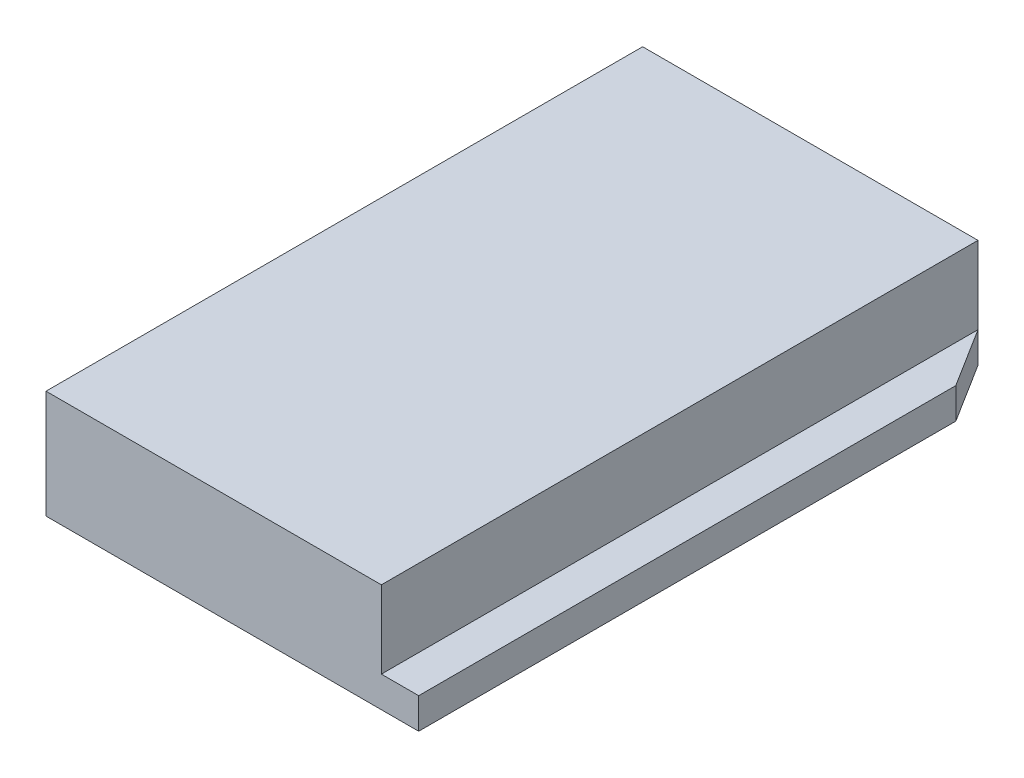
ISO-10303-21;
HEADER;
FILE_DESCRIPTION(('STEP AP214'),'2;1');
FILE_NAME('part.step','',(''),(''),'','','');
FILE_SCHEMA(('AUTOMOTIVE_DESIGN { 1 0 10303 214 1 1 1 1 }'));
ENDSEC;
DATA;
#1=APPLICATION_CONTEXT('core data for automotive mechanical design processes');
#2=APPLICATION_PROTOCOL_DEFINITION('international standard','automotive_design',2000,#1);
#3=PRODUCT_CONTEXT('',#1,'mechanical');
#4=PRODUCT('Part','Part','',(#3));
#5=PRODUCT_RELATED_PRODUCT_CATEGORY('part','',(#4));
#6=PRODUCT_DEFINITION_FORMATION('','',#4);
#7=PRODUCT_DEFINITION_CONTEXT('part definition',#1,'design');
#8=PRODUCT_DEFINITION('design','',#6,#7);
#9=PRODUCT_DEFINITION_SHAPE('','',#8);
#10=(LENGTH_UNIT() NAMED_UNIT(*) SI_UNIT(.MILLI.,.METRE.));
#11=(NAMED_UNIT(*) PLANE_ANGLE_UNIT() SI_UNIT($,.RADIAN.));
#12=(NAMED_UNIT(*) SI_UNIT($,.STERADIAN.) SOLID_ANGLE_UNIT());
#13=UNCERTAINTY_MEASURE_WITH_UNIT(LENGTH_MEASURE(1.E-05),#10,'distance_accuracy_value','');
#14=(GEOMETRIC_REPRESENTATION_CONTEXT(3) GLOBAL_UNCERTAINTY_ASSIGNED_CONTEXT((#13)) GLOBAL_UNIT_ASSIGNED_CONTEXT((#10,
#11,#12)) REPRESENTATION_CONTEXT('',''));
#15=CARTESIAN_POINT('',(0.,0.,0.));
#16=DIRECTION('',(0.,0.,1.));
#17=DIRECTION('',(1.,0.,0.));
#18=AXIS2_PLACEMENT_3D('',#15,#16,#17);
#19=CARTESIAN_POINT('',(0.,2.54,0.));
#20=DIRECTION('',(1.,0.,0.));
#21=DIRECTION('',(0.,0.,-1.));
#22=AXIS2_PLACEMENT_3D('',#19,#20,#21);
#23=PLANE('',#22);
#24=DIRECTION('',(0.,0.,1.));
#25=VECTOR('',#24,1.);
#26=CARTESIAN_POINT('',(0.,0.,0.));
#27=LINE('',#26,#25);
#28=CARTESIAN_POINT('',(0.,0.,-14.0081));
#29=VERTEX_POINT('',#28);
#30=CARTESIAN_POINT('',(0.,0.,0.));
#31=VERTEX_POINT('',#30);
#32=EDGE_CURVE('E222',#29,#31,#27,.T.);
#33=ORIENTED_EDGE('',*,*,#32,.T.);
#34=DIRECTION('',(0.,-1.,0.));
#35=VECTOR('',#34,1.);
#36=CARTESIAN_POINT('',(0.,2.54,0.));
#37=LINE('',#36,#35);
#38=CARTESIAN_POINT('',(0.,2.54,0.));
#39=VERTEX_POINT('',#38);
#40=EDGE_CURVE('E11',#39,#31,#37,.T.);
#41=ORIENTED_EDGE('',*,*,#40,.F.);
#42=DIRECTION('',(0.,0.,1.));
#43=VECTOR('',#42,1.);
#44=CARTESIAN_POINT('',(0.,2.54,0.));
#45=LINE('',#44,#43);
#46=CARTESIAN_POINT('',(0.,2.54,-14.0081));
#47=VERTEX_POINT('',#46);
#48=EDGE_CURVE('E219',#47,#39,#45,.T.);
#49=ORIENTED_EDGE('',*,*,#48,.F.);
#50=DIRECTION('',(0.,-1.,0.));
#51=VECTOR('',#50,1.);
#52=CARTESIAN_POINT('',(0.,2.54,-14.0081));
#53=LINE('',#52,#51);
#54=EDGE_CURVE('E208',#47,#29,#53,.T.);
#55=ORIENTED_EDGE('',*,*,#54,.T.);
#56=EDGE_LOOP('',(#33,#41,#49,#55));
#57=FACE_BOUND('',#56,.T.);
#58=ADVANCED_FACE('F32',(#57),#23,.F.);
#59=CARTESIAN_POINT('',(0.,2.54,0.));
#60=DIRECTION('',(0.,0.,-1.));
#61=DIRECTION('',(-1.,0.,0.));
#62=AXIS2_PLACEMENT_3D('',#59,#60,#61);
#63=PLANE('',#62);
#64=DIRECTION('',(1.,0.,0.));
#65=VECTOR('',#64,1.);
#66=CARTESIAN_POINT('',(0.,0.,0.));
#67=LINE('',#66,#65);
#68=CARTESIAN_POINT('',(8.7503,0.,0.));
#69=VERTEX_POINT('',#68);
#70=EDGE_CURVE('E220',#31,#69,#67,.T.);
#71=ORIENTED_EDGE('',*,*,#70,.T.);
#72=DIRECTION('',(0.,-1.,0.));
#73=VECTOR('',#72,1.);
#74=CARTESIAN_POINT('',(8.7503,0.7239,0.));
#75=LINE('',#74,#73);
#76=CARTESIAN_POINT('',(8.7503,0.7239,0.));
#77=VERTEX_POINT('',#76);
#78=EDGE_CURVE('E171',#77,#69,#75,.T.);
#79=ORIENTED_EDGE('',*,*,#78,.F.);
#80=DIRECTION('',(-1.,0.,0.));
#81=VECTOR('',#80,1.);
#82=CARTESIAN_POINT('',(7.874,0.7239,0.));
#83=LINE('',#82,#81);
#84=CARTESIAN_POINT('',(7.874,0.7239,0.));
#85=VERTEX_POINT('',#84);
#86=EDGE_CURVE('E176',#77,#85,#83,.T.);
#87=ORIENTED_EDGE('',*,*,#86,.T.);
#88=DIRECTION('',(0.,-1.,0.));
#89=VECTOR('',#88,1.);
#90=CARTESIAN_POINT('',(7.874,2.54,0.));
#91=LINE('',#90,#89);
#92=CARTESIAN_POINT('',(7.874,2.54,0.));
#93=VERTEX_POINT('',#92);
#94=EDGE_CURVE('E40',#93,#85,#91,.T.);
#95=ORIENTED_EDGE('',*,*,#94,.F.);
#96=DIRECTION('',(1.,0.,0.));
#97=VECTOR('',#96,1.);
#98=CARTESIAN_POINT('',(0.,2.54,0.));
#99=LINE('',#98,#97);
#100=EDGE_CURVE('E229',#39,#93,#99,.T.);
#101=ORIENTED_EDGE('',*,*,#100,.F.);
#102=ORIENTED_EDGE('',*,*,#40,.T.);
#103=EDGE_LOOP('',(#71,#79,#87,#95,#101,#102));
#104=FACE_BOUND('',#103,.T.);
#105=ADVANCED_FACE('F336',(#104),#63,.F.);
#106=CARTESIAN_POINT('',(7.874,2.54,0.));
#107=DIRECTION('',(-1.,0.,0.));
#108=DIRECTION('',(0.,0.,1.));
#109=AXIS2_PLACEMENT_3D('',#106,#107,#108);
#110=PLANE('',#109);
#111=ORIENTED_EDGE('',*,*,#94,.T.);
#112=DIRECTION('',(0.,0.,-1.));
#113=VECTOR('',#112,1.);
#114=CARTESIAN_POINT('',(7.874,0.7239,-14.0081));
#115=LINE('',#114,#113);
#116=CARTESIAN_POINT('',(7.874,0.7239,-14.0081));
#117=VERTEX_POINT('',#116);
#118=EDGE_CURVE('E172',#85,#117,#115,.T.);
#119=ORIENTED_EDGE('',*,*,#118,.T.);
#120=DIRECTION('',(0.,-1.,0.));
#121=VECTOR('',#120,1.);
#122=CARTESIAN_POINT('',(7.874,2.54,-14.0081));
#123=LINE('',#122,#121);
#124=CARTESIAN_POINT('',(7.874,2.54,-14.0081));
#125=VERTEX_POINT('',#124);
#126=EDGE_CURVE('E201',#125,#117,#123,.T.);
#127=ORIENTED_EDGE('',*,*,#126,.F.);
#128=DIRECTION('',(0.,0.,-1.));
#129=VECTOR('',#128,1.);
#130=CARTESIAN_POINT('',(7.874,2.54,0.));
#131=LINE('',#130,#129);
#132=EDGE_CURVE('E227',#93,#125,#131,.T.);
#133=ORIENTED_EDGE('',*,*,#132,.F.);
#134=EDGE_LOOP('',(#111,#119,#127,#133));
#135=FACE_BOUND('',#134,.T.);
#136=ADVANCED_FACE('F199',(#135),#110,.F.);
#137=CARTESIAN_POINT('',(0.,2.54,-14.0081));
#138=DIRECTION('',(0.,0.,1.));
#139=DIRECTION('',(1.,0.,0.));
#140=AXIS2_PLACEMENT_3D('',#137,#138,#139);
#141=PLANE('',#140);
#142=DIRECTION('',(-1.,0.,0.));
#143=VECTOR('',#142,1.);
#144=CARTESIAN_POINT('',(1.997075,0.8636,-14.0081));
#145=LINE('',#144,#143);
#146=CARTESIAN_POINT('',(1.997075,0.8636,-14.0081));
#147=VERTEX_POINT('',#146);
#148=CARTESIAN_POINT('',(0.89535,0.8636,-14.0081));
#149=VERTEX_POINT('',#148);
#150=EDGE_CURVE('E312',#147,#149,#145,.T.);
#151=ORIENTED_EDGE('',*,*,#150,.F.);
#152=DIRECTION('',(0.,-1.,0.));
#153=VECTOR('',#152,1.);
#154=CARTESIAN_POINT('',(1.997075,0.8636,-14.0081));
#155=LINE('',#154,#153);
#156=CARTESIAN_POINT('',(1.997075,1.8669,-14.0081));
#157=VERTEX_POINT('',#156);
#158=EDGE_CURVE('E56',#157,#147,#155,.T.);
#159=ORIENTED_EDGE('',*,*,#158,.F.);
#160=DIRECTION('',(1.,0.,0.));
#161=VECTOR('',#160,1.);
#162=CARTESIAN_POINT('',(1.997075,1.8669,-14.0081));
#163=LINE('',#162,#161);
#164=CARTESIAN_POINT('',(0.89535,1.8669,-14.0081));
#165=VERTEX_POINT('',#164);
#166=EDGE_CURVE('E305',#165,#157,#163,.T.);
#167=ORIENTED_EDGE('',*,*,#166,.F.);
#168=DIRECTION('',(0.,1.,0.));
#169=VECTOR('',#168,1.);
#170=CARTESIAN_POINT('',(0.89535,0.8636,-14.0081));
#171=LINE('',#170,#169);
#172=EDGE_CURVE('E309',#149,#165,#171,.T.);
#173=ORIENTED_EDGE('',*,*,#172,.F.);
#174=EDGE_LOOP('',(#151,#159,#167,#173));
#175=FACE_BOUND('',#174,.T.);
#176=DIRECTION('',(-1.,0.,0.));
#177=VECTOR('',#176,1.);
#178=CARTESIAN_POINT('',(4.5227875,0.8636,-14.0081));
#179=LINE('',#178,#177);
#180=CARTESIAN_POINT('',(4.5227875,0.8636,-14.0081));
#181=VERTEX_POINT('',#180);
#182=CARTESIAN_POINT('',(3.4210625,0.8636,-14.0081));
#183=VERTEX_POINT('',#182);
#184=EDGE_CURVE('E281',#181,#183,#179,.T.);
#185=ORIENTED_EDGE('',*,*,#184,.F.);
#186=DIRECTION('',(0.,-1.,0.));
#187=VECTOR('',#186,1.);
#188=CARTESIAN_POINT('',(4.5227875,1.8669,-14.0081));
#189=LINE('',#188,#187);
#190=CARTESIAN_POINT('',(4.5227875,1.8669,-14.0081));
#191=VERTEX_POINT('',#190);
#192=EDGE_CURVE('E284',#191,#181,#189,.T.);
#193=ORIENTED_EDGE('',*,*,#192,.F.);
#194=DIRECTION('',(1.,0.,0.));
#195=VECTOR('',#194,1.);
#196=CARTESIAN_POINT('',(4.5227875,1.8669,-14.0081));
#197=LINE('',#196,#195);
#198=CARTESIAN_POINT('',(3.4210625,1.8669,-14.0081));
#199=VERTEX_POINT('',#198);
#200=EDGE_CURVE('E274',#199,#191,#197,.T.);
#201=ORIENTED_EDGE('',*,*,#200,.F.);
#202=DIRECTION('',(0.,1.,0.));
#203=VECTOR('',#202,1.);
#204=CARTESIAN_POINT('',(3.4210625,1.8669,-14.0081));
#205=LINE('',#204,#203);
#206=EDGE_CURVE('E278',#183,#199,#205,.T.);
#207=ORIENTED_EDGE('',*,*,#206,.F.);
#208=EDGE_LOOP('',(#185,#193,#201,#207));
#209=FACE_BOUND('',#208,.T.);
#210=DIRECTION('',(-1.,0.,0.));
#211=VECTOR('',#210,1.);
#212=CARTESIAN_POINT('',(7.0485,0.8636,-14.0081));
#213=LINE('',#212,#211);
#214=CARTESIAN_POINT('',(7.0485,0.8636,-14.0081));
#215=VERTEX_POINT('',#214);
#216=CARTESIAN_POINT('',(5.946775,0.8636,-14.0081));
#217=VERTEX_POINT('',#216);
#218=EDGE_CURVE('E249',#215,#217,#213,.T.);
#219=ORIENTED_EDGE('',*,*,#218,.F.);
#220=DIRECTION('',(0.,-1.,0.));
#221=VECTOR('',#220,1.);
#222=CARTESIAN_POINT('',(7.0485,1.8669,-14.0081));
#223=LINE('',#222,#221);
#224=CARTESIAN_POINT('',(7.0485,1.8669,-14.0081));
#225=VERTEX_POINT('',#224);
#226=EDGE_CURVE('E252',#225,#215,#223,.T.);
#227=ORIENTED_EDGE('',*,*,#226,.F.);
#228=DIRECTION('',(1.,0.,0.));
#229=VECTOR('',#228,1.);
#230=CARTESIAN_POINT('',(7.0485,1.8669,-14.0081));
#231=LINE('',#230,#229);
#232=CARTESIAN_POINT('',(5.946775,1.8669,-14.0081));
#233=VERTEX_POINT('',#232);
#234=EDGE_CURVE('E242',#233,#225,#231,.T.);
#235=ORIENTED_EDGE('',*,*,#234,.F.);
#236=DIRECTION('',(0.,1.,0.));
#237=VECTOR('',#236,1.);
#238=CARTESIAN_POINT('',(5.946775,1.8669,-14.0081));
#239=LINE('',#238,#237);
#240=EDGE_CURVE('E246',#217,#233,#239,.T.);
#241=ORIENTED_EDGE('',*,*,#240,.F.);
#242=EDGE_LOOP('',(#219,#227,#235,#241));
#243=FACE_BOUND('',#242,.T.);
#244=DIRECTION('',(-1.,0.,0.));
#245=VECTOR('',#244,1.);
#246=CARTESIAN_POINT('',(0.,0.,-14.0081));
#247=LINE('',#246,#245);
#248=CARTESIAN_POINT('',(7.874,0.,-14.0081));
#249=VERTEX_POINT('',#248);
#250=EDGE_CURVE('E217',#249,#29,#247,.T.);
#251=ORIENTED_EDGE('',*,*,#250,.T.);
#252=ORIENTED_EDGE('',*,*,#54,.F.);
#253=DIRECTION('',(-1.,0.,0.));
#254=VECTOR('',#253,1.);
#255=CARTESIAN_POINT('',(0.,2.54,-14.0081));
#256=LINE('',#255,#254);
#257=EDGE_CURVE('E207',#125,#47,#256,.T.);
#258=ORIENTED_EDGE('',*,*,#257,.F.);
#259=ORIENTED_EDGE('',*,*,#126,.T.);
#260=DIRECTION('',(0.,-1.,0.));
#261=VECTOR('',#260,1.);
#262=CARTESIAN_POINT('',(7.874,0.7239,-14.0081));
#263=LINE('',#262,#261);
#264=EDGE_CURVE('E180',#117,#249,#263,.T.);
#265=ORIENTED_EDGE('',*,*,#264,.T.);
#266=EDGE_LOOP('',(#251,#252,#258,#259,#265));
#267=FACE_BOUND('',#266,.T.);
#268=ADVANCED_FACE('F204',(#175,#209,#243,#267),#141,.F.);
#269=CARTESIAN_POINT('',(0.,2.54,0.));
#270=DIRECTION('',(0.,-1.,0.));
#271=DIRECTION('',(0.,0.,-1.));
#272=AXIS2_PLACEMENT_3D('',#269,#270,#271);
#273=PLANE('',#272);
#274=ORIENTED_EDGE('',*,*,#48,.T.);
#275=ORIENTED_EDGE('',*,*,#100,.T.);
#276=ORIENTED_EDGE('',*,*,#132,.T.);
#277=ORIENTED_EDGE('',*,*,#257,.T.);
#278=EDGE_LOOP('',(#274,#275,#276,#277));
#279=FACE_BOUND('',#278,.T.);
#280=ADVANCED_FACE('F335',(#279),#273,.F.);
#281=CARTESIAN_POINT('',(0.,0.,0.));
#282=DIRECTION('',(0.,-1.,0.));
#283=DIRECTION('',(0.,0.,-1.));
#284=AXIS2_PLACEMENT_3D('',#281,#282,#283);
#285=PLANE('',#284);
#286=ORIENTED_EDGE('',*,*,#32,.F.);
#287=ORIENTED_EDGE('',*,*,#250,.F.);
#288=DIRECTION('',(0.531382718815397,0.,0.847131870575271));
#289=VECTOR('',#288,1.);
#290=CARTESIAN_POINT('',(7.874,0.,-14.0081));
#291=LINE('',#290,#289);
#292=CARTESIAN_POINT('',(8.7503,0.,-12.6111));
#293=VERTEX_POINT('',#292);
#294=EDGE_CURVE('E183',#249,#293,#291,.T.);
#295=ORIENTED_EDGE('',*,*,#294,.T.);
#296=DIRECTION('',(0.,0.,1.));
#297=VECTOR('',#296,1.);
#298=CARTESIAN_POINT('',(8.7503,0.,-12.6111));
#299=LINE('',#298,#297);
#300=EDGE_CURVE('E168',#293,#69,#299,.T.);
#301=ORIENTED_EDGE('',*,*,#300,.T.);
#302=ORIENTED_EDGE('',*,*,#70,.F.);
#303=EDGE_LOOP('',(#286,#287,#295,#301,#302));
#304=FACE_BOUND('',#303,.T.);
#305=ADVANCED_FACE('F330',(#304),#285,.T.);
#306=CARTESIAN_POINT('',(7.0485,1.8669,-5.3721));
#307=DIRECTION('',(1.,0.,0.));
#308=DIRECTION('',(0.,0.,-1.));
#309=AXIS2_PLACEMENT_3D('',#306,#307,#308);
#310=PLANE('',#309);
#311=ORIENTED_EDGE('',*,*,#226,.T.);
#312=DIRECTION('',(0.,0.,-1.));
#313=VECTOR('',#312,1.);
#314=CARTESIAN_POINT('',(7.0485,0.8636,-5.3721));
#315=LINE('',#314,#313);
#316=CARTESIAN_POINT('',(7.0485,0.8636,-5.3721));
#317=VERTEX_POINT('',#316);
#318=EDGE_CURVE('E233',#317,#215,#315,.T.);
#319=ORIENTED_EDGE('',*,*,#318,.F.);
#320=DIRECTION('',(0.,-1.,0.));
#321=VECTOR('',#320,1.);
#322=CARTESIAN_POINT('',(7.0485,1.8669,-5.3721));
#323=LINE('',#322,#321);
#324=CARTESIAN_POINT('',(7.0485,1.8669,-5.3721));
#325=VERTEX_POINT('',#324);
#326=EDGE_CURVE('E245',#325,#317,#323,.T.);
#327=ORIENTED_EDGE('',*,*,#326,.F.);
#328=DIRECTION('',(0.,0.,-1.));
#329=VECTOR('',#328,1.);
#330=CARTESIAN_POINT('',(7.0485,1.8669,-5.3721));
#331=LINE('',#330,#329);
#332=EDGE_CURVE('E225',#325,#225,#331,.T.);
#333=ORIENTED_EDGE('',*,*,#332,.T.);
#334=EDGE_LOOP('',(#311,#319,#327,#333));
#335=FACE_BOUND('',#334,.T.);
#336=ADVANCED_FACE('F349',(#335),#310,.F.);
#337=CARTESIAN_POINT('',(7.0485,1.8669,-5.3721));
#338=DIRECTION('',(0.,1.,0.));
#339=DIRECTION('',(-1.,0.,0.));
#340=AXIS2_PLACEMENT_3D('',#337,#338,#339);
#341=PLANE('',#340);
#342=ORIENTED_EDGE('',*,*,#234,.T.);
#343=ORIENTED_EDGE('',*,*,#332,.F.);
#344=DIRECTION('',(1.,0.,0.));
#345=VECTOR('',#344,1.);
#346=CARTESIAN_POINT('',(7.0485,1.8669,-5.3721));
#347=LINE('',#346,#345);
#348=CARTESIAN_POINT('',(5.946775,1.8669,-5.3721));
#349=VERTEX_POINT('',#348);
#350=EDGE_CURVE('E237',#349,#325,#347,.T.);
#351=ORIENTED_EDGE('',*,*,#350,.F.);
#352=DIRECTION('',(0.,0.,-1.));
#353=VECTOR('',#352,1.);
#354=CARTESIAN_POINT('',(5.946775,1.8669,-5.3721));
#355=LINE('',#354,#353);
#356=EDGE_CURVE('E239',#349,#233,#355,.T.);
#357=ORIENTED_EDGE('',*,*,#356,.T.);
#358=EDGE_LOOP('',(#342,#343,#351,#357));
#359=FACE_BOUND('',#358,.T.);
#360=ADVANCED_FACE('F354',(#359),#341,.F.);
#361=CARTESIAN_POINT('',(5.946775,1.8669,-5.3721));
#362=DIRECTION('',(-1.,0.,0.));
#363=DIRECTION('',(0.,-1.,0.));
#364=AXIS2_PLACEMENT_3D('',#361,#362,#363);
#365=PLANE('',#364);
#366=ORIENTED_EDGE('',*,*,#240,.T.);
#367=ORIENTED_EDGE('',*,*,#356,.F.);
#368=DIRECTION('',(0.,1.,0.));
#369=VECTOR('',#368,1.);
#370=CARTESIAN_POINT('',(5.946775,1.8669,-5.3721));
#371=LINE('',#370,#369);
#372=CARTESIAN_POINT('',(5.946775,0.8636,-5.3721));
#373=VERTEX_POINT('',#372);
#374=EDGE_CURVE('E257',#373,#349,#371,.T.);
#375=ORIENTED_EDGE('',*,*,#374,.F.);
#376=DIRECTION('',(0.,0.,-1.));
#377=VECTOR('',#376,1.);
#378=CARTESIAN_POINT('',(5.946775,0.8636,-5.3721));
#379=LINE('',#378,#377);
#380=EDGE_CURVE('E236',#373,#217,#379,.T.);
#381=ORIENTED_EDGE('',*,*,#380,.T.);
#382=EDGE_LOOP('',(#366,#367,#375,#381));
#383=FACE_BOUND('',#382,.T.);
#384=ADVANCED_FACE('F360',(#383),#365,.F.);
#385=CARTESIAN_POINT('',(7.0485,0.8636,-5.3721));
#386=DIRECTION('',(0.,-1.,0.));
#387=DIRECTION('',(0.,0.,-1.));
#388=AXIS2_PLACEMENT_3D('',#385,#386,#387);
#389=PLANE('',#388);
#390=ORIENTED_EDGE('',*,*,#218,.T.);
#391=ORIENTED_EDGE('',*,*,#380,.F.);
#392=DIRECTION('',(-1.,0.,0.));
#393=VECTOR('',#392,1.);
#394=CARTESIAN_POINT('',(7.0485,0.8636,-5.3721));
#395=LINE('',#394,#393);
#396=EDGE_CURVE('E260',#317,#373,#395,.T.);
#397=ORIENTED_EDGE('',*,*,#396,.F.);
#398=ORIENTED_EDGE('',*,*,#318,.T.);
#399=EDGE_LOOP('',(#390,#391,#397,#398));
#400=FACE_BOUND('',#399,.T.);
#401=ADVANCED_FACE('F356',(#400),#389,.F.);
#402=CARTESIAN_POINT('',(0.,0.,-5.3721));
#403=DIRECTION('',(0.,0.,-1.));
#404=DIRECTION('',(-1.,0.,0.));
#405=AXIS2_PLACEMENT_3D('',#402,#403,#404);
#406=PLANE('',#405);
#407=ORIENTED_EDGE('',*,*,#326,.T.);
#408=ORIENTED_EDGE('',*,*,#396,.T.);
#409=ORIENTED_EDGE('',*,*,#374,.T.);
#410=ORIENTED_EDGE('',*,*,#350,.T.);
#411=EDGE_LOOP('',(#407,#408,#409,#410));
#412=FACE_BOUND('',#411,.T.);
#413=ADVANCED_FACE('F359',(#412),#406,.T.);
#414=CARTESIAN_POINT('',(4.5227875,1.8669,-5.3721));
#415=DIRECTION('',(1.,0.,0.));
#416=DIRECTION('',(0.,1.,0.));
#417=AXIS2_PLACEMENT_3D('',#414,#415,#416);
#418=PLANE('',#417);
#419=ORIENTED_EDGE('',*,*,#192,.T.);
#420=DIRECTION('',(0.,0.,-1.));
#421=VECTOR('',#420,1.);
#422=CARTESIAN_POINT('',(4.5227875,0.8636,-5.3721));
#423=LINE('',#422,#421);
#424=CARTESIAN_POINT('',(4.5227875,0.8636,-5.3721));
#425=VERTEX_POINT('',#424);
#426=EDGE_CURVE('E265',#425,#181,#423,.T.);
#427=ORIENTED_EDGE('',*,*,#426,.F.);
#428=DIRECTION('',(0.,-1.,0.));
#429=VECTOR('',#428,1.);
#430=CARTESIAN_POINT('',(4.5227875,1.8669,-5.3721));
#431=LINE('',#430,#429);
#432=CARTESIAN_POINT('',(4.5227875,1.8669,-5.3721));
#433=VERTEX_POINT('',#432);
#434=EDGE_CURVE('E277',#433,#425,#431,.T.);
#435=ORIENTED_EDGE('',*,*,#434,.F.);
#436=DIRECTION('',(0.,0.,-1.));
#437=VECTOR('',#436,1.);
#438=CARTESIAN_POINT('',(4.5227875,1.8669,-5.3721));
#439=LINE('',#438,#437);
#440=EDGE_CURVE('E254',#433,#191,#439,.T.);
#441=ORIENTED_EDGE('',*,*,#440,.T.);
#442=EDGE_LOOP('',(#419,#427,#435,#441));
#443=FACE_BOUND('',#442,.T.);
#444=ADVANCED_FACE('F370',(#443),#418,.F.);
#445=CARTESIAN_POINT('',(4.5227875,1.8669,-5.3721));
#446=DIRECTION('',(0.,1.,0.));
#447=DIRECTION('',(0.,0.,1.));
#448=AXIS2_PLACEMENT_3D('',#445,#446,#447);
#449=PLANE('',#448);
#450=ORIENTED_EDGE('',*,*,#200,.T.);
#451=ORIENTED_EDGE('',*,*,#440,.F.);
#452=DIRECTION('',(1.,0.,0.));
#453=VECTOR('',#452,1.);
#454=CARTESIAN_POINT('',(4.5227875,1.8669,-5.3721));
#455=LINE('',#454,#453);
#456=CARTESIAN_POINT('',(3.4210625,1.8669,-5.3721));
#457=VERTEX_POINT('',#456);
#458=EDGE_CURVE('E269',#457,#433,#455,.T.);
#459=ORIENTED_EDGE('',*,*,#458,.F.);
#460=DIRECTION('',(0.,0.,-1.));
#461=VECTOR('',#460,1.);
#462=CARTESIAN_POINT('',(3.4210625,1.8669,-5.3721));
#463=LINE('',#462,#461);
#464=EDGE_CURVE('E271',#457,#199,#463,.T.);
#465=ORIENTED_EDGE('',*,*,#464,.T.);
#466=EDGE_LOOP('',(#450,#451,#459,#465));
#467=FACE_BOUND('',#466,.T.);
#468=ADVANCED_FACE('F374',(#467),#449,.F.);
#469=CARTESIAN_POINT('',(3.4210625,1.8669,-5.3721));
#470=DIRECTION('',(-1.,0.,0.));
#471=DIRECTION('',(0.,0.,1.));
#472=AXIS2_PLACEMENT_3D('',#469,#470,#471);
#473=PLANE('',#472);
#474=ORIENTED_EDGE('',*,*,#206,.T.);
#475=ORIENTED_EDGE('',*,*,#464,.F.);
#476=DIRECTION('',(0.,1.,0.));
#477=VECTOR('',#476,1.);
#478=CARTESIAN_POINT('',(3.4210625,1.8669,-5.3721));
#479=LINE('',#478,#477);
#480=CARTESIAN_POINT('',(3.4210625,0.8636,-5.3721));
#481=VERTEX_POINT('',#480);
#482=EDGE_CURVE('E289',#481,#457,#479,.T.);
#483=ORIENTED_EDGE('',*,*,#482,.F.);
#484=DIRECTION('',(0.,0.,-1.));
#485=VECTOR('',#484,1.);
#486=CARTESIAN_POINT('',(3.4210625,0.8636,-5.3721));
#487=LINE('',#486,#485);
#488=EDGE_CURVE('E268',#481,#183,#487,.T.);
#489=ORIENTED_EDGE('',*,*,#488,.T.);
#490=EDGE_LOOP('',(#474,#475,#483,#489));
#491=FACE_BOUND('',#490,.T.);
#492=ADVANCED_FACE('F380',(#491),#473,.F.);
#493=CARTESIAN_POINT('',(4.5227875,0.8636,-5.3721));
#494=DIRECTION('',(0.,-1.,0.));
#495=DIRECTION('',(0.,0.,-1.));
#496=AXIS2_PLACEMENT_3D('',#493,#494,#495);
#497=PLANE('',#496);
#498=ORIENTED_EDGE('',*,*,#184,.T.);
#499=ORIENTED_EDGE('',*,*,#488,.F.);
#500=DIRECTION('',(-1.,0.,0.));
#501=VECTOR('',#500,1.);
#502=CARTESIAN_POINT('',(4.5227875,0.8636,-5.3721));
#503=LINE('',#502,#501);
#504=EDGE_CURVE('E292',#425,#481,#503,.T.);
#505=ORIENTED_EDGE('',*,*,#504,.F.);
#506=ORIENTED_EDGE('',*,*,#426,.T.);
#507=EDGE_LOOP('',(#498,#499,#505,#506));
#508=FACE_BOUND('',#507,.T.);
#509=ADVANCED_FACE('F376',(#508),#497,.F.);
#510=CARTESIAN_POINT('',(0.,0.,-5.3721));
#511=DIRECTION('',(0.,0.,-1.));
#512=DIRECTION('',(-1.,0.,0.));
#513=AXIS2_PLACEMENT_3D('',#510,#511,#512);
#514=PLANE('',#513);
#515=ORIENTED_EDGE('',*,*,#434,.T.);
#516=ORIENTED_EDGE('',*,*,#504,.T.);
#517=ORIENTED_EDGE('',*,*,#482,.T.);
#518=ORIENTED_EDGE('',*,*,#458,.T.);
#519=EDGE_LOOP('',(#515,#516,#517,#518));
#520=FACE_BOUND('',#519,.T.);
#521=ADVANCED_FACE('F379',(#520),#514,.T.);
#522=CARTESIAN_POINT('',(1.997075,0.8636,-5.3721));
#523=DIRECTION('',(1.,0.,0.));
#524=DIRECTION('',(0.,1.,0.));
#525=AXIS2_PLACEMENT_3D('',#522,#523,#524);
#526=PLANE('',#525);
#527=ORIENTED_EDGE('',*,*,#158,.T.);
#528=DIRECTION('',(0.,0.,-1.));
#529=VECTOR('',#528,1.);
#530=CARTESIAN_POINT('',(1.997075,0.8636,-5.3721));
#531=LINE('',#530,#529);
#532=CARTESIAN_POINT('',(1.997075,0.8636,-5.3721));
#533=VERTEX_POINT('',#532);
#534=EDGE_CURVE('E297',#533,#147,#531,.T.);
#535=ORIENTED_EDGE('',*,*,#534,.F.);
#536=DIRECTION('',(0.,-1.,0.));
#537=VECTOR('',#536,1.);
#538=CARTESIAN_POINT('',(1.997075,0.8636,-5.3721));
#539=LINE('',#538,#537);
#540=CARTESIAN_POINT('',(1.997075,1.8669,-5.3721));
#541=VERTEX_POINT('',#540);
#542=EDGE_CURVE('E308',#541,#533,#539,.T.);
#543=ORIENTED_EDGE('',*,*,#542,.F.);
#544=DIRECTION('',(0.,0.,-1.));
#545=VECTOR('',#544,1.);
#546=CARTESIAN_POINT('',(1.997075,1.8669,-5.3721));
#547=LINE('',#546,#545);
#548=EDGE_CURVE('E286',#541,#157,#547,.T.);
#549=ORIENTED_EDGE('',*,*,#548,.T.);
#550=EDGE_LOOP('',(#527,#535,#543,#549));
#551=FACE_BOUND('',#550,.T.);
#552=ADVANCED_FACE('F390',(#551),#526,.F.);
#553=CARTESIAN_POINT('',(1.997075,1.8669,-5.3721));
#554=DIRECTION('',(0.,1.,0.));
#555=DIRECTION('',(-1.,0.,0.));
#556=AXIS2_PLACEMENT_3D('',#553,#554,#555);
#557=PLANE('',#556);
#558=ORIENTED_EDGE('',*,*,#166,.T.);
#559=ORIENTED_EDGE('',*,*,#548,.F.);
#560=DIRECTION('',(1.,0.,0.));
#561=VECTOR('',#560,1.);
#562=CARTESIAN_POINT('',(1.997075,1.8669,-5.3721));
#563=LINE('',#562,#561);
#564=CARTESIAN_POINT('',(0.89535,1.8669,-5.3721));
#565=VERTEX_POINT('',#564);
#566=EDGE_CURVE('E300',#565,#541,#563,.T.);
#567=ORIENTED_EDGE('',*,*,#566,.F.);
#568=DIRECTION('',(0.,0.,-1.));
#569=VECTOR('',#568,1.);
#570=CARTESIAN_POINT('',(0.89535,1.8669,-5.3721));
#571=LINE('',#570,#569);
#572=EDGE_CURVE('E302',#565,#165,#571,.T.);
#573=ORIENTED_EDGE('',*,*,#572,.T.);
#574=EDGE_LOOP('',(#558,#559,#567,#573));
#575=FACE_BOUND('',#574,.T.);
#576=ADVANCED_FACE('F394',(#575),#557,.F.);
#577=CARTESIAN_POINT('',(0.89535,0.8636,-5.3721));
#578=DIRECTION('',(-1.,0.,0.));
#579=DIRECTION('',(0.,0.,1.));
#580=AXIS2_PLACEMENT_3D('',#577,#578,#579);
#581=PLANE('',#580);
#582=ORIENTED_EDGE('',*,*,#172,.T.);
#583=ORIENTED_EDGE('',*,*,#572,.F.);
#584=DIRECTION('',(0.,1.,0.));
#585=VECTOR('',#584,1.);
#586=CARTESIAN_POINT('',(0.89535,0.8636,-5.3721));
#587=LINE('',#586,#585);
#588=CARTESIAN_POINT('',(0.89535,0.8636,-5.3721));
#589=VERTEX_POINT('',#588);
#590=EDGE_CURVE('E318',#589,#565,#587,.T.);
#591=ORIENTED_EDGE('',*,*,#590,.F.);
#592=DIRECTION('',(0.,0.,-1.));
#593=VECTOR('',#592,1.);
#594=CARTESIAN_POINT('',(0.89535,0.8636,-5.3721));
#595=LINE('',#594,#593);
#596=EDGE_CURVE('E299',#589,#149,#595,.T.);
#597=ORIENTED_EDGE('',*,*,#596,.T.);
#598=EDGE_LOOP('',(#582,#583,#591,#597));
#599=FACE_BOUND('',#598,.T.);
#600=ADVANCED_FACE('F399',(#599),#581,.F.);
#601=CARTESIAN_POINT('',(1.997075,0.8636,-5.3721));
#602=DIRECTION('',(0.,-1.,0.));
#603=DIRECTION('',(0.,0.,-1.));
#604=AXIS2_PLACEMENT_3D('',#601,#602,#603);
#605=PLANE('',#604);
#606=ORIENTED_EDGE('',*,*,#150,.T.);
#607=ORIENTED_EDGE('',*,*,#596,.F.);
#608=DIRECTION('',(-1.,0.,0.));
#609=VECTOR('',#608,1.);
#610=CARTESIAN_POINT('',(1.997075,0.8636,-5.3721));
#611=LINE('',#610,#609);
#612=EDGE_CURVE('E321',#533,#589,#611,.T.);
#613=ORIENTED_EDGE('',*,*,#612,.F.);
#614=ORIENTED_EDGE('',*,*,#534,.T.);
#615=EDGE_LOOP('',(#606,#607,#613,#614));
#616=FACE_BOUND('',#615,.T.);
#617=ADVANCED_FACE('F395',(#616),#605,.F.);
#618=CARTESIAN_POINT('',(0.,0.,-5.3721));
#619=DIRECTION('',(0.,0.,1.));
#620=DIRECTION('',(1.,0.,0.));
#621=AXIS2_PLACEMENT_3D('',#618,#619,#620);
#622=PLANE('',#621);
#623=ORIENTED_EDGE('',*,*,#542,.T.);
#624=ORIENTED_EDGE('',*,*,#612,.T.);
#625=ORIENTED_EDGE('',*,*,#590,.T.);
#626=ORIENTED_EDGE('',*,*,#566,.T.);
#627=EDGE_LOOP('',(#623,#624,#625,#626));
#628=FACE_BOUND('',#627,.T.);
#629=ADVANCED_FACE('F398',(#628),#622,.F.);
#630=CARTESIAN_POINT('',(7.874,0.7239,-14.0081));
#631=DIRECTION('',(0.84713187057527,0.,-0.531382718815397));
#632=DIRECTION('',(-0.531382718815397,0.,-0.847131870575271));
#633=AXIS2_PLACEMENT_3D('',#630,#631,#632);
#634=PLANE('',#633);
#635=ORIENTED_EDGE('',*,*,#294,.F.);
#636=ORIENTED_EDGE('',*,*,#264,.F.);
#637=DIRECTION('',(0.531382718815397,0.,0.847131870575271));
#638=VECTOR('',#637,1.);
#639=CARTESIAN_POINT('',(7.874,0.7239,-14.0081));
#640=LINE('',#639,#638);
#641=CARTESIAN_POINT('',(8.7503,0.7239,-12.6111));
#642=VERTEX_POINT('',#641);
#643=EDGE_CURVE('E48',#117,#642,#640,.T.);
#644=ORIENTED_EDGE('',*,*,#643,.T.);
#645=DIRECTION('',(0.,-1.,0.));
#646=VECTOR('',#645,1.);
#647=CARTESIAN_POINT('',(8.7503,0.7239,-12.6111));
#648=LINE('',#647,#646);
#649=EDGE_CURVE('E163',#642,#293,#648,.T.);
#650=ORIENTED_EDGE('',*,*,#649,.T.);
#651=EDGE_LOOP('',(#635,#636,#644,#650));
#652=FACE_BOUND('',#651,.T.);
#653=ADVANCED_FACE('F178',(#652),#634,.T.);
#654=CARTESIAN_POINT('',(8.7503,0.7239,-12.6111));
#655=DIRECTION('',(1.,0.,0.));
#656=DIRECTION('',(0.,0.,-1.));
#657=AXIS2_PLACEMENT_3D('',#654,#655,#656);
#658=PLANE('',#657);
#659=ORIENTED_EDGE('',*,*,#300,.F.);
#660=ORIENTED_EDGE('',*,*,#649,.F.);
#661=DIRECTION('',(0.,0.,1.));
#662=VECTOR('',#661,1.);
#663=CARTESIAN_POINT('',(8.7503,0.7239,-12.6111));
#664=LINE('',#663,#662);
#665=EDGE_CURVE('E166',#642,#77,#664,.T.);
#666=ORIENTED_EDGE('',*,*,#665,.T.);
#667=ORIENTED_EDGE('',*,*,#78,.T.);
#668=EDGE_LOOP('',(#659,#660,#666,#667));
#669=FACE_BOUND('',#668,.T.);
#670=ADVANCED_FACE('F164',(#669),#658,.T.);
#671=CARTESIAN_POINT('',(0.,0.7239,0.));
#672=DIRECTION('',(0.,1.,0.));
#673=DIRECTION('',(0.,0.,1.));
#674=AXIS2_PLACEMENT_3D('',#671,#672,#673);
#675=PLANE('',#674);
#676=ORIENTED_EDGE('',*,*,#643,.F.);
#677=ORIENTED_EDGE('',*,*,#118,.F.);
#678=ORIENTED_EDGE('',*,*,#86,.F.);
#679=ORIENTED_EDGE('',*,*,#665,.F.);
#680=EDGE_LOOP('',(#676,#677,#678,#679));
#681=FACE_BOUND('',#680,.T.);
#682=ADVANCED_FACE('F175',(#681),#675,.T.);
#683=CLOSED_SHELL('',(#58,#105,#136,#268,#280,#305,#336,#360,#384,#401,#413,#444,#468,#492,#509,
#521,#552,#576,#600,#617,#629,#653,#670,#682));
#684=MANIFOLD_SOLID_BREP('B2',#683);
#685=ADVANCED_BREP_SHAPE_REPRESENTATION('',(#18,#684),#14);
#686=SHAPE_DEFINITION_REPRESENTATION(#9,#685);
ENDSEC;
END-ISO-10303-21;
